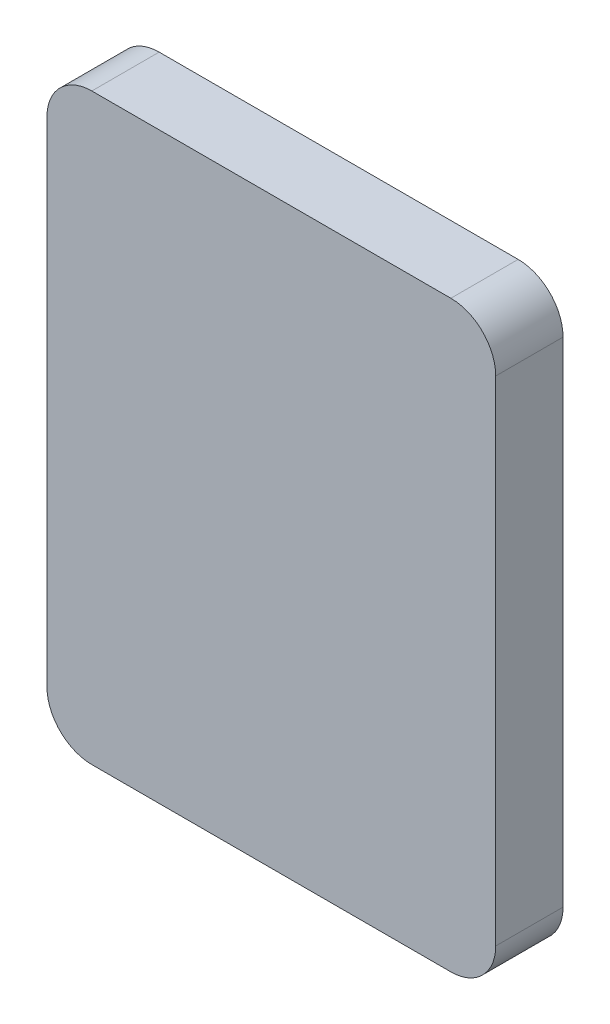
ISO-10303-21;
HEADER;
FILE_DESCRIPTION(('STEP AP214'),'2;1');
FILE_NAME('part.step','',(''),(''),'','','');
FILE_SCHEMA(('AUTOMOTIVE_DESIGN { 1 0 10303 214 1 1 1 1 }'));
ENDSEC;
DATA;
#1=APPLICATION_CONTEXT('core data for automotive mechanical design processes');
#2=APPLICATION_PROTOCOL_DEFINITION('international standard','automotive_design',2000,#1);
#3=PRODUCT_CONTEXT('',#1,'mechanical');
#4=PRODUCT('Part','Part','',(#3));
#5=PRODUCT_RELATED_PRODUCT_CATEGORY('part','',(#4));
#6=PRODUCT_DEFINITION_FORMATION('','',#4);
#7=PRODUCT_DEFINITION_CONTEXT('part definition',#1,'design');
#8=PRODUCT_DEFINITION('design','',#6,#7);
#9=PRODUCT_DEFINITION_SHAPE('','',#8);
#10=(LENGTH_UNIT() NAMED_UNIT(*) SI_UNIT(.MILLI.,.METRE.));
#11=(NAMED_UNIT(*) PLANE_ANGLE_UNIT() SI_UNIT($,.RADIAN.));
#12=(NAMED_UNIT(*) SI_UNIT($,.STERADIAN.) SOLID_ANGLE_UNIT());
#13=UNCERTAINTY_MEASURE_WITH_UNIT(LENGTH_MEASURE(1.E-05),#10,'distance_accuracy_value','');
#14=(GEOMETRIC_REPRESENTATION_CONTEXT(3) GLOBAL_UNCERTAINTY_ASSIGNED_CONTEXT((#13)) GLOBAL_UNIT_ASSIGNED_CONTEXT((#10,
#11,#12)) REPRESENTATION_CONTEXT('',''));
#15=CARTESIAN_POINT('',(0.,0.,0.));
#16=DIRECTION('',(0.,0.,1.));
#17=DIRECTION('',(1.,0.,0.));
#18=AXIS2_PLACEMENT_3D('',#15,#16,#17);
#19=CARTESIAN_POINT('',(-4.,-5.5,1.5));
#20=DIRECTION('',(0.,0.,-1.));
#21=DIRECTION('',(-1.,0.,0.));
#22=AXIS2_PLACEMENT_3D('',#19,#20,#21);
#23=CYLINDRICAL_SURFACE('',#22,1.);
#24=CARTESIAN_POINT('',(-4.,-5.5,0.));
#25=DIRECTION('',(0.,0.,1.));
#26=DIRECTION('',(-1.,0.,0.));
#27=AXIS2_PLACEMENT_3D('',#24,#25,#26);
#28=CIRCLE('',#27,1.);
#29=CARTESIAN_POINT('',(-5.,-5.49999999999999,0.));
#30=VERTEX_POINT('',#29);
#31=CARTESIAN_POINT('',(-3.99999999999999,-6.5,0.));
#32=VERTEX_POINT('',#31);
#33=EDGE_CURVE('E141',#30,#32,#28,.T.);
#34=ORIENTED_EDGE('',*,*,#33,.T.);
#35=DIRECTION('',(0.,0.,-1.));
#36=VECTOR('',#35,1.);
#37=CARTESIAN_POINT('',(-3.99999999999999,-6.5,1.5));
#38=LINE('',#37,#36);
#39=CARTESIAN_POINT('',(-3.99999999999999,-6.5,1.5));
#40=VERTEX_POINT('',#39);
#41=EDGE_CURVE('E11',#40,#32,#38,.T.);
#42=ORIENTED_EDGE('',*,*,#41,.F.);
#43=CARTESIAN_POINT('',(-4.,-5.5,1.5));
#44=DIRECTION('',(0.,0.,1.));
#45=DIRECTION('',(-1.,0.,0.));
#46=AXIS2_PLACEMENT_3D('',#43,#44,#45);
#47=CIRCLE('',#46,1.);
#48=CARTESIAN_POINT('',(-5.,-5.49999999999999,1.5));
#49=VERTEX_POINT('',#48);
#50=EDGE_CURVE('E163',#49,#40,#47,.T.);
#51=ORIENTED_EDGE('',*,*,#50,.F.);
#52=DIRECTION('',(0.,0.,-1.));
#53=VECTOR('',#52,1.);
#54=CARTESIAN_POINT('',(-5.,-5.49999999999999,1.5));
#55=LINE('',#54,#53);
#56=EDGE_CURVE('E137',#49,#30,#55,.T.);
#57=ORIENTED_EDGE('',*,*,#56,.T.);
#58=EDGE_LOOP('',(#34,#42,#51,#57));
#59=FACE_BOUND('',#58,.T.);
#60=ADVANCED_FACE('F38',(#59),#23,.T.);
#61=CARTESIAN_POINT('',(3.99999999999999,-6.5,1.5));
#62=DIRECTION('',(0.,1.,0.));
#63=DIRECTION('',(-1.,0.,0.));
#64=AXIS2_PLACEMENT_3D('',#61,#62,#63);
#65=PLANE('',#64);
#66=DIRECTION('',(1.,0.,0.));
#67=VECTOR('',#66,1.);
#68=CARTESIAN_POINT('',(3.99999999999999,-6.5,0.));
#69=LINE('',#68,#67);
#70=CARTESIAN_POINT('',(3.99999999999999,-6.5,0.));
#71=VERTEX_POINT('',#70);
#72=EDGE_CURVE('E145',#32,#71,#69,.T.);
#73=ORIENTED_EDGE('',*,*,#72,.T.);
#74=DIRECTION('',(0.,0.,-1.));
#75=VECTOR('',#74,1.);
#76=CARTESIAN_POINT('',(3.99999999999999,-6.5,1.5));
#77=LINE('',#76,#75);
#78=CARTESIAN_POINT('',(3.99999999999999,-6.5,1.5));
#79=VERTEX_POINT('',#78);
#80=EDGE_CURVE('E47',#79,#71,#77,.T.);
#81=ORIENTED_EDGE('',*,*,#80,.F.);
#82=DIRECTION('',(1.,0.,0.));
#83=VECTOR('',#82,1.);
#84=CARTESIAN_POINT('',(3.99999999999999,-6.5,1.5));
#85=LINE('',#84,#83);
#86=EDGE_CURVE('E98',#40,#79,#85,.T.);
#87=ORIENTED_EDGE('',*,*,#86,.F.);
#88=ORIENTED_EDGE('',*,*,#41,.T.);
#89=EDGE_LOOP('',(#73,#81,#87,#88));
#90=FACE_BOUND('',#89,.T.);
#91=ADVANCED_FACE('F207',(#90),#65,.F.);
#92=CARTESIAN_POINT('',(4.,-5.5,1.5));
#93=DIRECTION('',(0.,0.,-1.));
#94=DIRECTION('',(-1.,0.,0.));
#95=AXIS2_PLACEMENT_3D('',#92,#93,#94);
#96=CYLINDRICAL_SURFACE('',#95,1.);
#97=CARTESIAN_POINT('',(4.,-5.5,0.));
#98=DIRECTION('',(0.,0.,1.));
#99=DIRECTION('',(1.,0.,0.));
#100=AXIS2_PLACEMENT_3D('',#97,#98,#99);
#101=CIRCLE('',#100,1.);
#102=CARTESIAN_POINT('',(5.,-5.5,0.));
#103=VERTEX_POINT('',#102);
#104=EDGE_CURVE('E148',#71,#103,#101,.T.);
#105=ORIENTED_EDGE('',*,*,#104,.T.);
#106=DIRECTION('',(0.,0.,-1.));
#107=VECTOR('',#106,1.);
#108=CARTESIAN_POINT('',(5.,-5.5,1.5));
#109=LINE('',#108,#107);
#110=CARTESIAN_POINT('',(5.,-5.5,1.5));
#111=VERTEX_POINT('',#110);
#112=EDGE_CURVE('E174',#111,#103,#109,.T.);
#113=ORIENTED_EDGE('',*,*,#112,.F.);
#114=CARTESIAN_POINT('',(4.,-5.5,1.5));
#115=DIRECTION('',(0.,0.,1.));
#116=DIRECTION('',(1.,0.,0.));
#117=AXIS2_PLACEMENT_3D('',#114,#115,#116);
#118=CIRCLE('',#117,1.);
#119=EDGE_CURVE('E184',#79,#111,#118,.T.);
#120=ORIENTED_EDGE('',*,*,#119,.F.);
#121=ORIENTED_EDGE('',*,*,#80,.T.);
#122=EDGE_LOOP('',(#105,#113,#120,#121));
#123=FACE_BOUND('',#122,.T.);
#124=ADVANCED_FACE('F182',(#123),#96,.T.);
#125=CARTESIAN_POINT('',(5.,-5.49999999999999,1.5));
#126=DIRECTION('',(-1.,0.,0.));
#127=DIRECTION('',(0.,0.,1.));
#128=AXIS2_PLACEMENT_3D('',#125,#126,#127);
#129=PLANE('',#128);
#130=DIRECTION('',(0.,1.,0.));
#131=VECTOR('',#130,1.);
#132=CARTESIAN_POINT('',(5.,-5.49999999999999,0.));
#133=LINE('',#132,#131);
#134=CARTESIAN_POINT('',(5.,5.49999999999999,0.));
#135=VERTEX_POINT('',#134);
#136=EDGE_CURVE('E151',#103,#135,#133,.T.);
#137=ORIENTED_EDGE('',*,*,#136,.T.);
#138=DIRECTION('',(0.,0.,-1.));
#139=VECTOR('',#138,1.);
#140=CARTESIAN_POINT('',(5.,5.49999999999999,1.5));
#141=LINE('',#140,#139);
#142=CARTESIAN_POINT('',(5.,5.49999999999999,1.5));
#143=VERTEX_POINT('',#142);
#144=EDGE_CURVE('E170',#143,#135,#141,.T.);
#145=ORIENTED_EDGE('',*,*,#144,.F.);
#146=DIRECTION('',(0.,1.,0.));
#147=VECTOR('',#146,1.);
#148=CARTESIAN_POINT('',(5.,-5.49999999999999,1.5));
#149=LINE('',#148,#147);
#150=EDGE_CURVE('E196',#111,#143,#149,.T.);
#151=ORIENTED_EDGE('',*,*,#150,.F.);
#152=ORIENTED_EDGE('',*,*,#112,.T.);
#153=EDGE_LOOP('',(#137,#145,#151,#152));
#154=FACE_BOUND('',#153,.T.);
#155=ADVANCED_FACE('F192',(#154),#129,.F.);
#156=CARTESIAN_POINT('',(4.,5.5,1.5));
#157=DIRECTION('',(0.,0.,-1.));
#158=DIRECTION('',(-1.,0.,0.));
#159=AXIS2_PLACEMENT_3D('',#156,#157,#158);
#160=CYLINDRICAL_SURFACE('',#159,1.);
#161=CARTESIAN_POINT('',(4.,5.5,0.));
#162=DIRECTION('',(0.,0.,1.));
#163=DIRECTION('',(1.,0.,0.));
#164=AXIS2_PLACEMENT_3D('',#161,#162,#163);
#165=CIRCLE('',#164,1.);
#166=CARTESIAN_POINT('',(3.99999999999999,6.5,0.));
#167=VERTEX_POINT('',#166);
#168=EDGE_CURVE('E154',#135,#167,#165,.T.);
#169=ORIENTED_EDGE('',*,*,#168,.T.);
#170=DIRECTION('',(0.,0.,-1.));
#171=VECTOR('',#170,1.);
#172=CARTESIAN_POINT('',(3.99999999999999,6.5,1.5));
#173=LINE('',#172,#171);
#174=CARTESIAN_POINT('',(3.99999999999999,6.5,1.5));
#175=VERTEX_POINT('',#174);
#176=EDGE_CURVE('E128',#175,#167,#173,.T.);
#177=ORIENTED_EDGE('',*,*,#176,.F.);
#178=CARTESIAN_POINT('',(4.,5.5,1.5));
#179=DIRECTION('',(0.,0.,1.));
#180=DIRECTION('',(1.,0.,0.));
#181=AXIS2_PLACEMENT_3D('',#178,#179,#180);
#182=CIRCLE('',#181,1.);
#183=EDGE_CURVE('E117',#143,#175,#182,.T.);
#184=ORIENTED_EDGE('',*,*,#183,.F.);
#185=ORIENTED_EDGE('',*,*,#144,.T.);
#186=EDGE_LOOP('',(#169,#177,#184,#185));
#187=FACE_BOUND('',#186,.T.);
#188=ADVANCED_FACE('F195',(#187),#160,.T.);
#189=CARTESIAN_POINT('',(3.99999999999999,6.5,1.5));
#190=DIRECTION('',(0.,-1.,0.));
#191=DIRECTION('',(1.,0.,0.));
#192=AXIS2_PLACEMENT_3D('',#189,#190,#191);
#193=PLANE('',#192);
#194=DIRECTION('',(-1.,0.,0.));
#195=VECTOR('',#194,1.);
#196=CARTESIAN_POINT('',(3.99999999999999,6.5,0.));
#197=LINE('',#196,#195);
#198=CARTESIAN_POINT('',(-3.99999999999999,6.5,0.));
#199=VERTEX_POINT('',#198);
#200=EDGE_CURVE('E126',#167,#199,#197,.T.);
#201=ORIENTED_EDGE('',*,*,#200,.T.);
#202=DIRECTION('',(0.,0.,-1.));
#203=VECTOR('',#202,1.);
#204=CARTESIAN_POINT('',(-3.99999999999999,6.5,1.5));
#205=LINE('',#204,#203);
#206=CARTESIAN_POINT('',(-3.99999999999999,6.5,1.5));
#207=VERTEX_POINT('',#206);
#208=EDGE_CURVE('E123',#207,#199,#205,.T.);
#209=ORIENTED_EDGE('',*,*,#208,.F.);
#210=DIRECTION('',(-1.,0.,0.));
#211=VECTOR('',#210,1.);
#212=CARTESIAN_POINT('',(3.99999999999999,6.5,1.5));
#213=LINE('',#212,#211);
#214=EDGE_CURVE('E111',#175,#207,#213,.T.);
#215=ORIENTED_EDGE('',*,*,#214,.F.);
#216=ORIENTED_EDGE('',*,*,#176,.T.);
#217=EDGE_LOOP('',(#201,#209,#215,#216));
#218=FACE_BOUND('',#217,.T.);
#219=ADVANCED_FACE('F124',(#218),#193,.F.);
#220=CARTESIAN_POINT('',(-4.,5.5,1.5));
#221=DIRECTION('',(0.,0.,-1.));
#222=DIRECTION('',(-1.,0.,0.));
#223=AXIS2_PLACEMENT_3D('',#220,#221,#222);
#224=CYLINDRICAL_SURFACE('',#223,1.);
#225=CARTESIAN_POINT('',(-4.,5.5,0.));
#226=DIRECTION('',(0.,0.,1.));
#227=DIRECTION('',(1.,0.,0.));
#228=AXIS2_PLACEMENT_3D('',#225,#226,#227);
#229=CIRCLE('',#228,1.);
#230=CARTESIAN_POINT('',(-5.,5.49999999999999,0.));
#231=VERTEX_POINT('',#230);
#232=EDGE_CURVE('E84',#199,#231,#229,.T.);
#233=ORIENTED_EDGE('',*,*,#232,.T.);
#234=DIRECTION('',(0.,0.,-1.));
#235=VECTOR('',#234,1.);
#236=CARTESIAN_POINT('',(-5.,5.49999999999999,1.5));
#237=LINE('',#236,#235);
#238=CARTESIAN_POINT('',(-5.,5.49999999999999,1.5));
#239=VERTEX_POINT('',#238);
#240=EDGE_CURVE('E129',#239,#231,#237,.T.);
#241=ORIENTED_EDGE('',*,*,#240,.F.);
#242=CARTESIAN_POINT('',(-4.,5.5,1.5));
#243=DIRECTION('',(0.,0.,1.));
#244=DIRECTION('',(1.,0.,0.));
#245=AXIS2_PLACEMENT_3D('',#242,#243,#244);
#246=CIRCLE('',#245,1.);
#247=EDGE_CURVE('E115',#207,#239,#246,.T.);
#248=ORIENTED_EDGE('',*,*,#247,.F.);
#249=ORIENTED_EDGE('',*,*,#208,.T.);
#250=EDGE_LOOP('',(#233,#241,#248,#249));
#251=FACE_BOUND('',#250,.T.);
#252=ADVANCED_FACE('F131',(#251),#224,.T.);
#253=CARTESIAN_POINT('',(-5.,-5.49999999999999,1.5));
#254=DIRECTION('',(1.,0.,0.));
#255=DIRECTION('',(0.,0.,-1.));
#256=AXIS2_PLACEMENT_3D('',#253,#254,#255);
#257=PLANE('',#256);
#258=DIRECTION('',(0.,-1.,0.));
#259=VECTOR('',#258,1.);
#260=CARTESIAN_POINT('',(-5.,-5.49999999999999,0.));
#261=LINE('',#260,#259);
#262=EDGE_CURVE('E90',#231,#30,#261,.T.);
#263=ORIENTED_EDGE('',*,*,#262,.T.);
#264=ORIENTED_EDGE('',*,*,#56,.F.);
#265=DIRECTION('',(0.,-1.,0.));
#266=VECTOR('',#265,1.);
#267=CARTESIAN_POINT('',(-5.,-5.49999999999999,1.5));
#268=LINE('',#267,#266);
#269=EDGE_CURVE('E55',#239,#49,#268,.T.);
#270=ORIENTED_EDGE('',*,*,#269,.F.);
#271=ORIENTED_EDGE('',*,*,#240,.T.);
#272=EDGE_LOOP('',(#263,#264,#270,#271));
#273=FACE_BOUND('',#272,.T.);
#274=ADVANCED_FACE('F223',(#273),#257,.F.);
#275=CARTESIAN_POINT('',(-4.,-5.5,1.5));
#276=DIRECTION('',(0.,0.,-1.));
#277=DIRECTION('',(-1.,0.,0.));
#278=AXIS2_PLACEMENT_3D('',#275,#276,#277);
#279=PLANE('',#278);
#280=ORIENTED_EDGE('',*,*,#50,.T.);
#281=ORIENTED_EDGE('',*,*,#86,.T.);
#282=ORIENTED_EDGE('',*,*,#119,.T.);
#283=ORIENTED_EDGE('',*,*,#150,.T.);
#284=ORIENTED_EDGE('',*,*,#183,.T.);
#285=ORIENTED_EDGE('',*,*,#214,.T.);
#286=ORIENTED_EDGE('',*,*,#247,.T.);
#287=ORIENTED_EDGE('',*,*,#269,.T.);
#288=EDGE_LOOP('',(#280,#281,#282,#283,#284,#285,#286,#287));
#289=FACE_BOUND('',#288,.T.);
#290=ADVANCED_FACE('F113',(#289),#279,.F.);
#291=CARTESIAN_POINT('',(-4.,-5.5,0.));
#292=DIRECTION('',(0.,0.,-1.));
#293=DIRECTION('',(-1.,0.,0.));
#294=AXIS2_PLACEMENT_3D('',#291,#292,#293);
#295=PLANE('',#294);
#296=ORIENTED_EDGE('',*,*,#33,.F.);
#297=ORIENTED_EDGE('',*,*,#262,.F.);
#298=ORIENTED_EDGE('',*,*,#232,.F.);
#299=ORIENTED_EDGE('',*,*,#200,.F.);
#300=ORIENTED_EDGE('',*,*,#168,.F.);
#301=ORIENTED_EDGE('',*,*,#136,.F.);
#302=ORIENTED_EDGE('',*,*,#104,.F.);
#303=ORIENTED_EDGE('',*,*,#72,.F.);
#304=EDGE_LOOP('',(#296,#297,#298,#299,#300,#301,#302,#303));
#305=FACE_BOUND('',#304,.T.);
#306=ADVANCED_FACE('F188',(#305),#295,.T.);
#307=CLOSED_SHELL('',(#60,#91,#124,#155,#188,#219,#252,#274,#290,#306));
#308=MANIFOLD_SOLID_BREP('B2',#307);
#309=ADVANCED_BREP_SHAPE_REPRESENTATION('',(#18,#308),#14);
#310=SHAPE_DEFINITION_REPRESENTATION(#9,#309);
ENDSEC;
END-ISO-10303-21;
